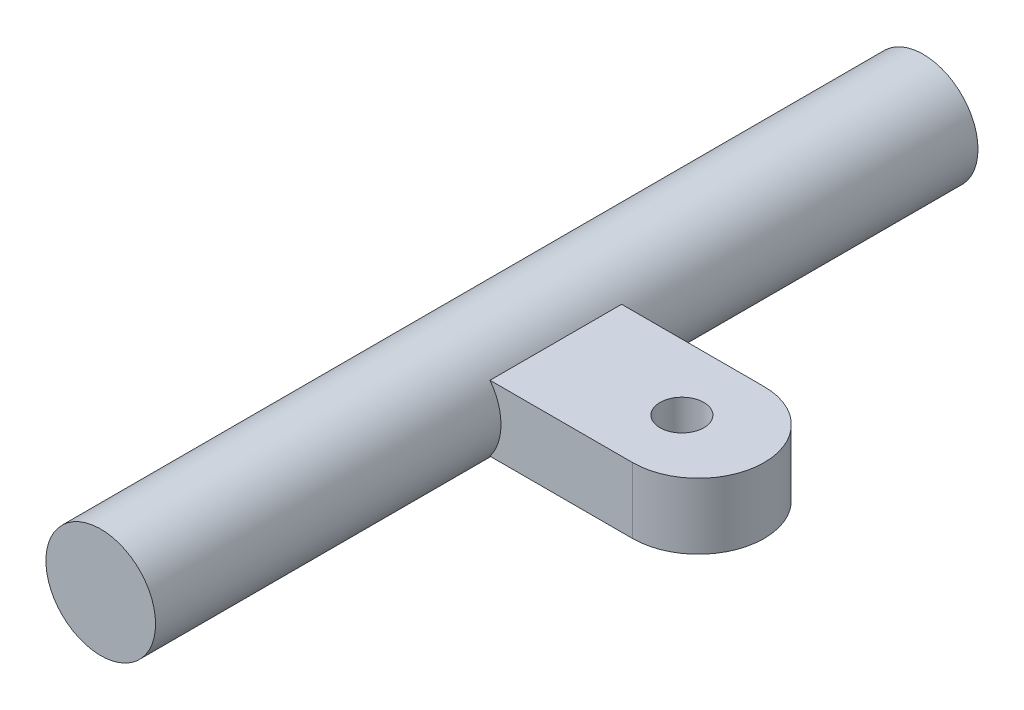
ISO-10303-21;
HEADER;
FILE_DESCRIPTION(('STEP AP214'),'2;1');
FILE_NAME('part.step','',(''),(''),'','','');
FILE_SCHEMA(('AUTOMOTIVE_DESIGN { 1 0 10303 214 1 1 1 1 }'));
ENDSEC;
DATA;
#1=APPLICATION_CONTEXT('core data for automotive mechanical design processes');
#2=APPLICATION_PROTOCOL_DEFINITION('international standard','automotive_design',2000,#1);
#3=PRODUCT_CONTEXT('',#1,'mechanical');
#4=PRODUCT('Part','Part','',(#3));
#5=PRODUCT_RELATED_PRODUCT_CATEGORY('part','',(#4));
#6=PRODUCT_DEFINITION_FORMATION('','',#4);
#7=PRODUCT_DEFINITION_CONTEXT('part definition',#1,'design');
#8=PRODUCT_DEFINITION('design','',#6,#7);
#9=PRODUCT_DEFINITION_SHAPE('','',#8);
#10=(LENGTH_UNIT() NAMED_UNIT(*) SI_UNIT(.MILLI.,.METRE.));
#11=(NAMED_UNIT(*) PLANE_ANGLE_UNIT() SI_UNIT($,.RADIAN.));
#12=(NAMED_UNIT(*) SI_UNIT($,.STERADIAN.) SOLID_ANGLE_UNIT());
#13=UNCERTAINTY_MEASURE_WITH_UNIT(LENGTH_MEASURE(1.E-05),#10,'distance_accuracy_value','');
#14=(GEOMETRIC_REPRESENTATION_CONTEXT(3) GLOBAL_UNCERTAINTY_ASSIGNED_CONTEXT((#13)) GLOBAL_UNIT_ASSIGNED_CONTEXT((#10,
#11,#12)) REPRESENTATION_CONTEXT('',''));
#15=CARTESIAN_POINT('',(0.,0.,0.));
#16=DIRECTION('',(0.,0.,1.));
#17=DIRECTION('',(1.,0.,0.));
#18=AXIS2_PLACEMENT_3D('',#15,#16,#17);
#19=CARTESIAN_POINT('',(8.5,3.,0.));
#20=DIRECTION('',(0.,-1.,0.));
#21=DIRECTION('',(0.,0.,-1.));
#22=AXIS2_PLACEMENT_3D('',#19,#20,#21);
#23=PLANE('',#22);
#24=CARTESIAN_POINT('',(7.,3.,0.));
#25=DIRECTION('',(0.,1.,0.));
#26=DIRECTION('',(0.,0.,1.));
#27=AXIS2_PLACEMENT_3D('',#24,#25,#26);
#28=CIRCLE('',#27,2.);
#29=CARTESIAN_POINT('',(7.,3.,2.));
#30=VERTEX_POINT('',#29);
#31=EDGE_CURVE('E102',#30,#30,#28,.T.);
#32=ORIENTED_EDGE('',*,*,#31,.F.);
#33=EDGE_LOOP('',(#32));
#34=FACE_BOUND('',#33,.T.);
#35=DIRECTION('',(0.,0.,-1.));
#36=VECTOR('',#35,1.);
#37=CARTESIAN_POINT('',(-4.5,3.,37.5));
#38=LINE('',#37,#36);
#39=CARTESIAN_POINT('',(-4.5,3.,6.));
#40=VERTEX_POINT('',#39);
#41=CARTESIAN_POINT('',(-4.5,3.,-6.));
#42=VERTEX_POINT('',#41);
#43=EDGE_CURVE('E51',#40,#42,#38,.T.);
#44=ORIENTED_EDGE('',*,*,#43,.F.);
#45=DIRECTION('',(1.,0.,0.));
#46=VECTOR('',#45,1.);
#47=CARTESIAN_POINT('',(8.5,3.,6.));
#48=LINE('',#47,#46);
#49=CARTESIAN_POINT('',(8.5,3.,6.));
#50=VERTEX_POINT('',#49);
#51=EDGE_CURVE('E86',#40,#50,#48,.T.);
#52=ORIENTED_EDGE('',*,*,#51,.T.);
#53=CARTESIAN_POINT('',(8.5,3.,0.));
#54=DIRECTION('',(0.,1.,0.));
#55=DIRECTION('',(0.,0.,-1.));
#56=AXIS2_PLACEMENT_3D('',#53,#54,#55);
#57=CIRCLE('',#56,6.);
#58=CARTESIAN_POINT('',(8.5,3.,-6.));
#59=VERTEX_POINT('',#58);
#60=EDGE_CURVE('E108',#50,#59,#57,.T.);
#61=ORIENTED_EDGE('',*,*,#60,.T.);
#62=DIRECTION('',(-1.,0.,0.));
#63=VECTOR('',#62,1.);
#64=CARTESIAN_POINT('',(8.5,3.,-6.));
#65=LINE('',#64,#63);
#66=EDGE_CURVE('E110',#59,#42,#65,.T.);
#67=ORIENTED_EDGE('',*,*,#66,.T.);
#68=EDGE_LOOP('',(#44,#52,#61,#67));
#69=FACE_BOUND('',#68,.T.);
#70=ADVANCED_FACE('F36',(#34,#69),#23,.F.);
#71=CARTESIAN_POINT('',(8.5,-3.,0.));
#72=DIRECTION('',(0.,-1.,0.));
#73=DIRECTION('',(0.,0.,-1.));
#74=AXIS2_PLACEMENT_3D('',#71,#72,#73);
#75=PLANE('',#74);
#76=CARTESIAN_POINT('',(7.,-3.,0.));
#77=DIRECTION('',(0.,1.,0.));
#78=DIRECTION('',(0.,0.,1.));
#79=AXIS2_PLACEMENT_3D('',#76,#77,#78);
#80=CIRCLE('',#79,2.);
#81=CARTESIAN_POINT('',(7.,-3.,2.));
#82=VERTEX_POINT('',#81);
#83=EDGE_CURVE('E98',#82,#82,#80,.T.);
#84=ORIENTED_EDGE('',*,*,#83,.T.);
#85=EDGE_LOOP('',(#84));
#86=FACE_BOUND('',#85,.T.);
#87=DIRECTION('',(1.,0.,0.));
#88=VECTOR('',#87,1.);
#89=CARTESIAN_POINT('',(8.5,-3.,6.));
#90=LINE('',#89,#88);
#91=CARTESIAN_POINT('',(-4.5,-3.,6.));
#92=VERTEX_POINT('',#91);
#93=CARTESIAN_POINT('',(8.5,-3.,6.));
#94=VERTEX_POINT('',#93);
#95=EDGE_CURVE('E92',#92,#94,#90,.T.);
#96=ORIENTED_EDGE('',*,*,#95,.F.);
#97=DIRECTION('',(0.,0.,-1.));
#98=VECTOR('',#97,1.);
#99=CARTESIAN_POINT('',(-4.5,-3.,37.5));
#100=LINE('',#99,#98);
#101=CARTESIAN_POINT('',(-4.5,-3.,-6.));
#102=VERTEX_POINT('',#101);
#103=EDGE_CURVE('E90',#92,#102,#100,.T.);
#104=ORIENTED_EDGE('',*,*,#103,.T.);
#105=DIRECTION('',(-1.,0.,0.));
#106=VECTOR('',#105,1.);
#107=CARTESIAN_POINT('',(8.5,-3.,-6.));
#108=LINE('',#107,#106);
#109=CARTESIAN_POINT('',(8.5,-3.,-6.));
#110=VERTEX_POINT('',#109);
#111=EDGE_CURVE('E78',#110,#102,#108,.T.);
#112=ORIENTED_EDGE('',*,*,#111,.F.);
#113=CARTESIAN_POINT('',(8.5,-3.,0.));
#114=DIRECTION('',(0.,1.,0.));
#115=DIRECTION('',(0.,0.,-1.));
#116=AXIS2_PLACEMENT_3D('',#113,#114,#115);
#117=CIRCLE('',#116,6.);
#118=EDGE_CURVE('E87',#94,#110,#117,.T.);
#119=ORIENTED_EDGE('',*,*,#118,.F.);
#120=EDGE_LOOP('',(#96,#104,#112,#119));
#121=FACE_BOUND('',#120,.T.);
#122=ADVANCED_FACE('F91',(#86,#121),#75,.T.);
#123=CARTESIAN_POINT('',(8.5,3.,6.));
#124=DIRECTION('',(0.,0.,-1.));
#125=DIRECTION('',(-1.,0.,0.));
#126=AXIS2_PLACEMENT_3D('',#123,#124,#125);
#127=PLANE('',#126);
#128=CARTESIAN_POINT('',(-8.5,0.,6.));
#129=DIRECTION('',(0.,0.,-1.));
#130=DIRECTION('',(-1.,0.,0.));
#131=AXIS2_PLACEMENT_3D('',#128,#129,#130);
#132=CIRCLE('',#131,5.);
#133=EDGE_CURVE('E58',#92,#40,#132,.F.);
#134=ORIENTED_EDGE('',*,*,#133,.F.);
#135=ORIENTED_EDGE('',*,*,#95,.T.);
#136=DIRECTION('',(0.,-1.,0.));
#137=VECTOR('',#136,1.);
#138=CARTESIAN_POINT('',(8.5,3.,6.));
#139=LINE('',#138,#137);
#140=EDGE_CURVE('E44',#50,#94,#139,.T.);
#141=ORIENTED_EDGE('',*,*,#140,.F.);
#142=ORIENTED_EDGE('',*,*,#51,.F.);
#143=EDGE_LOOP('',(#134,#135,#141,#142));
#144=FACE_BOUND('',#143,.T.);
#145=ADVANCED_FACE('F38',(#144),#127,.F.);
#146=CARTESIAN_POINT('',(8.5,3.,0.));
#147=DIRECTION('',(0.,-1.,0.));
#148=DIRECTION('',(0.,0.,-1.));
#149=AXIS2_PLACEMENT_3D('',#146,#147,#148);
#150=CYLINDRICAL_SURFACE('',#149,6.);
#151=ORIENTED_EDGE('',*,*,#118,.T.);
#152=DIRECTION('',(0.,-1.,0.));
#153=VECTOR('',#152,1.);
#154=CARTESIAN_POINT('',(8.5,3.,-6.));
#155=LINE('',#154,#153);
#156=EDGE_CURVE('E83',#59,#110,#155,.T.);
#157=ORIENTED_EDGE('',*,*,#156,.F.);
#158=ORIENTED_EDGE('',*,*,#60,.F.);
#159=ORIENTED_EDGE('',*,*,#140,.T.);
#160=EDGE_LOOP('',(#151,#157,#158,#159));
#161=FACE_BOUND('',#160,.T.);
#162=ADVANCED_FACE('F118',(#161),#150,.T.);
#163=CARTESIAN_POINT('',(8.5,3.,-6.));
#164=DIRECTION('',(0.,0.,1.));
#165=DIRECTION('',(1.,0.,0.));
#166=AXIS2_PLACEMENT_3D('',#163,#164,#165);
#167=PLANE('',#166);
#168=CARTESIAN_POINT('',(-8.5,0.,-6.));
#169=DIRECTION('',(0.,0.,1.));
#170=DIRECTION('',(1.,0.,0.));
#171=AXIS2_PLACEMENT_3D('',#168,#169,#170);
#172=CIRCLE('',#171,5.);
#173=EDGE_CURVE('E11',#42,#102,#172,.F.);
#174=ORIENTED_EDGE('',*,*,#173,.F.);
#175=ORIENTED_EDGE('',*,*,#66,.F.);
#176=ORIENTED_EDGE('',*,*,#156,.T.);
#177=ORIENTED_EDGE('',*,*,#111,.T.);
#178=EDGE_LOOP('',(#174,#175,#176,#177));
#179=FACE_BOUND('',#178,.T.);
#180=ADVANCED_FACE('F80',(#179),#167,.F.);
#181=CARTESIAN_POINT('',(7.,3.,0.));
#182=DIRECTION('',(0.,-1.,0.));
#183=DIRECTION('',(0.,0.,-1.));
#184=AXIS2_PLACEMENT_3D('',#181,#182,#183);
#185=CYLINDRICAL_SURFACE('',#184,2.);
#186=ORIENTED_EDGE('',*,*,#31,.T.);
#187=EDGE_LOOP('',(#186));
#188=FACE_BOUND('',#187,.T.);
#189=ORIENTED_EDGE('',*,*,#83,.F.);
#190=EDGE_LOOP('',(#189));
#191=FACE_BOUND('',#190,.T.);
#192=ADVANCED_FACE('F129',(#188,#191),#185,.F.);
#193=CARTESIAN_POINT('',(-8.5,0.,37.5));
#194=DIRECTION('',(0.,0.,-1.));
#195=DIRECTION('',(-1.,0.,0.));
#196=AXIS2_PLACEMENT_3D('',#193,#194,#195);
#197=CYLINDRICAL_SURFACE('',#196,5.);
#198=CARTESIAN_POINT('',(-8.5,0.,37.5));
#199=DIRECTION('',(0.,0.,1.));
#200=DIRECTION('',(1.,0.,0.));
#201=AXIS2_PLACEMENT_3D('',#198,#199,#200);
#202=CIRCLE('',#201,5.);
#203=CARTESIAN_POINT('',(-3.5,0.,37.5));
#204=VERTEX_POINT('',#203);
#205=EDGE_CURVE('E94',#204,#204,#202,.T.);
#206=ORIENTED_EDGE('',*,*,#205,.F.);
#207=EDGE_LOOP('',(#206));
#208=FACE_BOUND('',#207,.T.);
#209=CARTESIAN_POINT('',(-8.5,0.,-37.5));
#210=DIRECTION('',(0.,0.,1.));
#211=DIRECTION('',(1.,0.,0.));
#212=AXIS2_PLACEMENT_3D('',#209,#210,#211);
#213=CIRCLE('',#212,5.);
#214=CARTESIAN_POINT('',(-3.5,0.,-37.5));
#215=VERTEX_POINT('',#214);
#216=EDGE_CURVE('E201',#215,#215,#213,.T.);
#217=ORIENTED_EDGE('',*,*,#216,.T.);
#218=EDGE_LOOP('',(#217));
#219=FACE_BOUND('',#218,.T.);
#220=ORIENTED_EDGE('',*,*,#103,.F.);
#221=ORIENTED_EDGE('',*,*,#133,.T.);
#222=ORIENTED_EDGE('',*,*,#43,.T.);
#223=ORIENTED_EDGE('',*,*,#173,.T.);
#224=EDGE_LOOP('',(#220,#221,#222,#223));
#225=FACE_BOUND('',#224,.T.);
#226=ADVANCED_FACE('F96',(#208,#219,#225),#197,.T.);
#227=CARTESIAN_POINT('',(-8.5,0.,37.5));
#228=DIRECTION('',(0.,0.,1.));
#229=DIRECTION('',(1.,0.,0.));
#230=AXIS2_PLACEMENT_3D('',#227,#228,#229);
#231=PLANE('',#230);
#232=ORIENTED_EDGE('',*,*,#205,.T.);
#233=EDGE_LOOP('',(#232));
#234=FACE_BOUND('',#233,.T.);
#235=ADVANCED_FACE('F176',(#234),#231,.T.);
#236=CARTESIAN_POINT('',(-8.5,0.,-37.5));
#237=DIRECTION('',(0.,0.,1.));
#238=DIRECTION('',(1.,0.,0.));
#239=AXIS2_PLACEMENT_3D('',#236,#237,#238);
#240=PLANE('',#239);
#241=ORIENTED_EDGE('',*,*,#216,.F.);
#242=EDGE_LOOP('',(#241));
#243=FACE_BOUND('',#242,.T.);
#244=ADVANCED_FACE('F185',(#243),#240,.F.);
#245=CLOSED_SHELL('',(#70,#122,#145,#162,#180,#192,#226,#235,#244));
#246=MANIFOLD_SOLID_BREP('B2',#245);
#247=ADVANCED_BREP_SHAPE_REPRESENTATION('',(#18,#246),#14);
#248=SHAPE_DEFINITION_REPRESENTATION(#9,#247);
ENDSEC;
END-ISO-10303-21;
